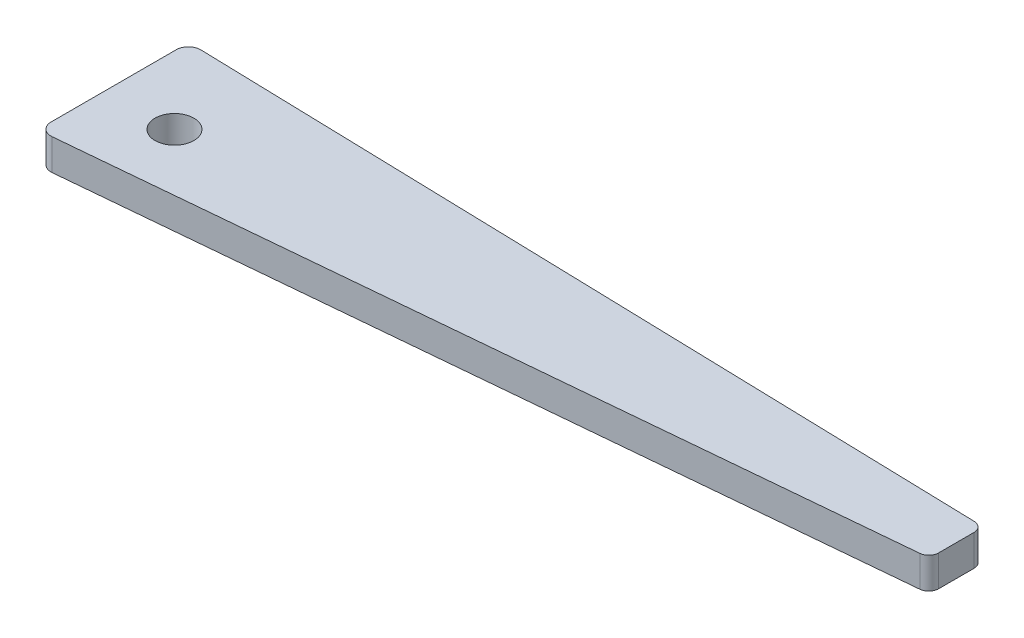
ISO-10303-21;
HEADER;
FILE_DESCRIPTION(('STEP AP214'),'2;1');
FILE_NAME('part.step','',(''),(''),'','','');
FILE_SCHEMA(('AUTOMOTIVE_DESIGN { 1 0 10303 214 1 1 1 1 }'));
ENDSEC;
DATA;
#1=APPLICATION_CONTEXT('core data for automotive mechanical design processes');
#2=APPLICATION_PROTOCOL_DEFINITION('international standard','automotive_design',2000,#1);
#3=PRODUCT_CONTEXT('',#1,'mechanical');
#4=PRODUCT('Part','Part','',(#3));
#5=PRODUCT_RELATED_PRODUCT_CATEGORY('part','',(#4));
#6=PRODUCT_DEFINITION_FORMATION('','',#4);
#7=PRODUCT_DEFINITION_CONTEXT('part definition',#1,'design');
#8=PRODUCT_DEFINITION('design','',#6,#7);
#9=PRODUCT_DEFINITION_SHAPE('','',#8);
#10=(LENGTH_UNIT() NAMED_UNIT(*) SI_UNIT(.MILLI.,.METRE.));
#11=(NAMED_UNIT(*) PLANE_ANGLE_UNIT() SI_UNIT($,.RADIAN.));
#12=(NAMED_UNIT(*) SI_UNIT($,.STERADIAN.) SOLID_ANGLE_UNIT());
#13=UNCERTAINTY_MEASURE_WITH_UNIT(LENGTH_MEASURE(1.E-05),#10,'distance_accuracy_value','');
#14=(GEOMETRIC_REPRESENTATION_CONTEXT(3) GLOBAL_UNCERTAINTY_ASSIGNED_CONTEXT((#13)) GLOBAL_UNIT_ASSIGNED_CONTEXT((#10,
#11,#12)) REPRESENTATION_CONTEXT('',''));
#15=CARTESIAN_POINT('',(0.,0.,0.));
#16=DIRECTION('',(0.,0.,1.));
#17=DIRECTION('',(1.,0.,0.));
#18=AXIS2_PLACEMENT_3D('',#15,#16,#17);
#19=CARTESIAN_POINT('',(41.5,1.6,-4.31765934935754));
#20=DIRECTION('',(0.,-1.,0.));
#21=DIRECTION('',(0.,0.,-1.));
#22=AXIS2_PLACEMENT_3D('',#19,#20,#21);
#23=CYLINDRICAL_SURFACE('',#22,0.5);
#24=CARTESIAN_POINT('',(41.5,0.,-4.31765934935754));
#25=DIRECTION('',(0.,1.,0.));
#26=DIRECTION('',(0.,0.,1.));
#27=AXIS2_PLACEMENT_3D('',#24,#25,#26);
#28=CIRCLE('',#27,0.5);
#29=CARTESIAN_POINT('',(41.5457774137299,0.,-3.81975933088777));
#30=VERTEX_POINT('',#29);
#31=CARTESIAN_POINT('',(42.,0.,-4.31765934935755));
#32=VERTEX_POINT('',#31);
#33=EDGE_CURVE('E133',#30,#32,#28,.T.);
#34=ORIENTED_EDGE('',*,*,#33,.T.);
#35=DIRECTION('',(0.,-1.,0.));
#36=VECTOR('',#35,1.);
#37=CARTESIAN_POINT('',(42.,1.6,-4.31765934935755));
#38=LINE('',#37,#36);
#39=CARTESIAN_POINT('',(42.,1.6,-4.31765934935755));
#40=VERTEX_POINT('',#39);
#41=EDGE_CURVE('E11',#40,#32,#38,.T.);
#42=ORIENTED_EDGE('',*,*,#41,.F.);
#43=CARTESIAN_POINT('',(41.5,1.6,-4.31765934935754));
#44=DIRECTION('',(0.,1.,0.));
#45=DIRECTION('',(0.,0.,1.));
#46=AXIS2_PLACEMENT_3D('',#43,#44,#45);
#47=CIRCLE('',#46,0.5);
#48=CARTESIAN_POINT('',(41.5457774137299,1.6,-3.81975933088777));
#49=VERTEX_POINT('',#48);
#50=EDGE_CURVE('E148',#49,#40,#47,.T.);
#51=ORIENTED_EDGE('',*,*,#50,.F.);
#52=DIRECTION('',(0.,-1.,0.));
#53=VECTOR('',#52,1.);
#54=CARTESIAN_POINT('',(41.5457774137299,1.6,-3.81975933088777));
#55=LINE('',#54,#53);
#56=EDGE_CURVE('E129',#49,#30,#55,.T.);
#57=ORIENTED_EDGE('',*,*,#56,.T.);
#58=EDGE_LOOP('',(#34,#42,#51,#57));
#59=FACE_BOUND('',#58,.T.);
#60=ADVANCED_FACE('F37',(#59),#23,.T.);
#61=CARTESIAN_POINT('',(42.,1.6,-4.31765934935755));
#62=DIRECTION('',(-1.,0.,0.));
#63=DIRECTION('',(0.,0.,1.));
#64=AXIS2_PLACEMENT_3D('',#61,#62,#63);
#65=PLANE('',#64);
#66=DIRECTION('',(0.,0.,-1.));
#67=VECTOR('',#66,1.);
#68=CARTESIAN_POINT('',(42.,0.,-4.31765934935755));
#69=LINE('',#68,#67);
#70=CARTESIAN_POINT('',(42.,0.,-6.13999611769491));
#71=VERTEX_POINT('',#70);
#72=EDGE_CURVE('E136',#32,#71,#69,.T.);
#73=ORIENTED_EDGE('',*,*,#72,.T.);
#74=DIRECTION('',(0.,-1.,0.));
#75=VECTOR('',#74,1.);
#76=CARTESIAN_POINT('',(42.,1.6,-6.13999611769491));
#77=LINE('',#76,#75);
#78=CARTESIAN_POINT('',(42.,1.6,-6.13999611769491));
#79=VERTEX_POINT('',#78);
#80=EDGE_CURVE('E45',#79,#71,#77,.T.);
#81=ORIENTED_EDGE('',*,*,#80,.F.);
#82=DIRECTION('',(0.,0.,-1.));
#83=VECTOR('',#82,1.);
#84=CARTESIAN_POINT('',(42.,1.6,-4.31765934935755));
#85=LINE('',#84,#83);
#86=EDGE_CURVE('E96',#40,#79,#85,.T.);
#87=ORIENTED_EDGE('',*,*,#86,.F.);
#88=ORIENTED_EDGE('',*,*,#41,.T.);
#89=EDGE_LOOP('',(#73,#81,#87,#88));
#90=FACE_BOUND('',#89,.T.);
#91=ADVANCED_FACE('F204',(#90),#65,.F.);
#92=CARTESIAN_POINT('',(41.5,1.6,-6.13999611769492));
#93=DIRECTION('',(0.,-1.,0.));
#94=DIRECTION('',(0.,0.,-1.));
#95=AXIS2_PLACEMENT_3D('',#92,#93,#94);
#96=CYLINDRICAL_SURFACE('',#95,0.500000000000001);
#97=CARTESIAN_POINT('',(41.5,0.,-6.13999611769492));
#98=DIRECTION('',(0.,1.,0.));
#99=DIRECTION('',(0.,0.,1.));
#100=AXIS2_PLACEMENT_3D('',#97,#98,#99);
#101=CIRCLE('',#100,0.500000000000001);
#102=CARTESIAN_POINT('',(41.5136158340435,0.,-6.63981069237567));
#103=VERTEX_POINT('',#102);
#104=EDGE_CURVE('E139',#71,#103,#101,.T.);
#105=ORIENTED_EDGE('',*,*,#104,.T.);
#106=DIRECTION('',(0.,-1.,0.));
#107=VECTOR('',#106,1.);
#108=CARTESIAN_POINT('',(41.5136158340435,1.6,-6.63981069237567));
#109=LINE('',#108,#107);
#110=CARTESIAN_POINT('',(41.5136158340435,1.6,-6.63981069237567));
#111=VERTEX_POINT('',#110);
#112=EDGE_CURVE('E155',#111,#103,#109,.T.);
#113=ORIENTED_EDGE('',*,*,#112,.F.);
#114=CARTESIAN_POINT('',(41.5,1.6,-6.13999611769492));
#115=DIRECTION('',(0.,1.,0.));
#116=DIRECTION('',(0.,0.,1.));
#117=AXIS2_PLACEMENT_3D('',#114,#115,#116);
#118=CIRCLE('',#117,0.500000000000001);
#119=EDGE_CURVE('E163',#79,#111,#118,.T.);
#120=ORIENTED_EDGE('',*,*,#119,.F.);
#121=ORIENTED_EDGE('',*,*,#80,.T.);
#122=EDGE_LOOP('',(#105,#113,#120,#121));
#123=FACE_BOUND('',#122,.T.);
#124=ADVANCED_FACE('F161',(#123),#96,.T.);
#125=CARTESIAN_POINT('',(41.5136158340435,1.6,-6.63981069237567));
#126=DIRECTION('',(-0.0272316680870328,0.,0.999629149361501));
#127=DIRECTION('',(0.999629149361501,0.,0.0272316680870328));
#128=AXIS2_PLACEMENT_3D('',#125,#126,#127);
#129=PLANE('',#128);
#130=DIRECTION('',(-0.999629149361501,0.,-0.0272316680870328));
#131=VECTOR('',#130,1.);
#132=CARTESIAN_POINT('',(41.5136158340435,0.,-6.63981069237567));
#133=LINE('',#132,#131);
#134=CARTESIAN_POINT('',(0.647236121998095,0.,-7.75308323844728));
#135=VERTEX_POINT('',#134);
#136=EDGE_CURVE('E141',#103,#135,#133,.T.);
#137=ORIENTED_EDGE('',*,*,#136,.T.);
#138=DIRECTION('',(0.,-1.,0.));
#139=VECTOR('',#138,1.);
#140=CARTESIAN_POINT('',(0.647236121998095,1.6,-7.75308323844728));
#141=LINE('',#140,#139);
#142=CARTESIAN_POINT('',(0.647236121998095,1.6,-7.75308323844728));
#143=VERTEX_POINT('',#142);
#144=EDGE_CURVE('E152',#143,#135,#141,.T.);
#145=ORIENTED_EDGE('',*,*,#144,.F.);
#146=DIRECTION('',(-0.999629149361501,0.,-0.0272316680870328));
#147=VECTOR('',#146,1.);
#148=CARTESIAN_POINT('',(41.5136158340435,1.6,-6.63981069237567));
#149=LINE('',#148,#147);
#150=EDGE_CURVE('E175',#111,#143,#149,.T.);
#151=ORIENTED_EDGE('',*,*,#150,.F.);
#152=ORIENTED_EDGE('',*,*,#112,.T.);
#153=EDGE_LOOP('',(#137,#145,#151,#152));
#154=FACE_BOUND('',#153,.T.);
#155=ADVANCED_FACE('F171',(#154),#129,.F.);
#156=CARTESIAN_POINT('',(0.630078045786312,1.6,-7.12323885750655));
#157=DIRECTION('',(0.,-1.,0.));
#158=DIRECTION('',(0.,0.,-1.));
#159=AXIS2_PLACEMENT_3D('',#156,#157,#158);
#160=CYLINDRICAL_SURFACE('',#159,0.630078045786312);
#161=CARTESIAN_POINT('',(0.630078045786312,0.,-7.12323885750655));
#162=DIRECTION('',(0.,1.,0.));
#163=DIRECTION('',(0.,0.,1.));
#164=AXIS2_PLACEMENT_3D('',#161,#162,#163);
#165=CIRCLE('',#164,0.630078045786312);
#166=CARTESIAN_POINT('',(0.,0.,-7.12323885750654));
#167=VERTEX_POINT('',#166);
#168=EDGE_CURVE('E143',#135,#167,#165,.T.);
#169=ORIENTED_EDGE('',*,*,#168,.T.);
#170=DIRECTION('',(0.,-1.,0.));
#171=VECTOR('',#170,1.);
#172=CARTESIAN_POINT('',(0.,1.6,-7.12323885750654));
#173=LINE('',#172,#171);
#174=CARTESIAN_POINT('',(0.,1.6,-7.12323885750654));
#175=VERTEX_POINT('',#174);
#176=EDGE_CURVE('E124',#175,#167,#173,.T.);
#177=ORIENTED_EDGE('',*,*,#176,.F.);
#178=CARTESIAN_POINT('',(0.630078045786312,1.6,-7.12323885750655));
#179=DIRECTION('',(0.,1.,0.));
#180=DIRECTION('',(0.,0.,1.));
#181=AXIS2_PLACEMENT_3D('',#178,#179,#180);
#182=CIRCLE('',#181,0.630078045786312);
#183=EDGE_CURVE('E115',#143,#175,#182,.T.);
#184=ORIENTED_EDGE('',*,*,#183,.F.);
#185=ORIENTED_EDGE('',*,*,#144,.T.);
#186=EDGE_LOOP('',(#169,#177,#184,#185));
#187=FACE_BOUND('',#186,.T.);
#188=ADVANCED_FACE('F174',(#187),#160,.T.);
#189=CARTESIAN_POINT('',(0.,1.6,-7.12323885750654));
#190=DIRECTION('',(1.,0.,0.));
#191=DIRECTION('',(0.,0.,-1.));
#192=AXIS2_PLACEMENT_3D('',#189,#190,#191);
#193=PLANE('',#192);
#194=DIRECTION('',(0.,0.,1.));
#195=VECTOR('',#194,1.);
#196=CARTESIAN_POINT('',(0.,0.,-7.12323885750654));
#197=LINE('',#196,#195);
#198=CARTESIAN_POINT('',(0.,0.,-0.690665502150667));
#199=VERTEX_POINT('',#198);
#200=EDGE_CURVE('E123',#167,#199,#197,.T.);
#201=ORIENTED_EDGE('',*,*,#200,.T.);
#202=DIRECTION('',(0.,-1.,0.));
#203=VECTOR('',#202,1.);
#204=CARTESIAN_POINT('',(0.,1.6,-0.690665502150667));
#205=LINE('',#204,#203);
#206=CARTESIAN_POINT('',(0.,1.6,-0.690665502150667));
#207=VERTEX_POINT('',#206);
#208=EDGE_CURVE('E120',#207,#199,#205,.T.);
#209=ORIENTED_EDGE('',*,*,#208,.F.);
#210=DIRECTION('',(0.,0.,1.));
#211=VECTOR('',#210,1.);
#212=CARTESIAN_POINT('',(0.,1.6,-7.12323885750654));
#213=LINE('',#212,#211);
#214=EDGE_CURVE('E109',#175,#207,#213,.T.);
#215=ORIENTED_EDGE('',*,*,#214,.F.);
#216=ORIENTED_EDGE('',*,*,#176,.T.);
#217=EDGE_LOOP('',(#201,#209,#215,#216));
#218=FACE_BOUND('',#217,.T.);
#219=ADVANCED_FACE('F121',(#218),#193,.F.);
#220=CARTESIAN_POINT('',(0.630078045786312,1.6,-0.690665502150662));
#221=DIRECTION('',(0.,-1.,0.));
#222=DIRECTION('',(0.,0.,-1.));
#223=AXIS2_PLACEMENT_3D('',#220,#221,#222);
#224=CYLINDRICAL_SURFACE('',#223,0.630078045786312);
#225=CARTESIAN_POINT('',(0.630078045786312,0.,-0.690665502150662));
#226=DIRECTION('',(0.,1.,0.));
#227=DIRECTION('',(0.,0.,-1.));
#228=AXIS2_PLACEMENT_3D('',#225,#226,#227);
#229=CIRCLE('',#228,0.630078045786312);
#230=CARTESIAN_POINT('',(0.687764732554505,0.,-0.0632337608818557));
#231=VERTEX_POINT('',#230);
#232=EDGE_CURVE('E82',#199,#231,#229,.T.);
#233=ORIENTED_EDGE('',*,*,#232,.T.);
#234=DIRECTION('',(0.,-1.,0.));
#235=VECTOR('',#234,1.);
#236=CARTESIAN_POINT('',(0.687764732554505,1.6,-0.0632337608818557));
#237=LINE('',#236,#235);
#238=CARTESIAN_POINT('',(0.687764732554505,1.6,-0.0632337608818557));
#239=VERTEX_POINT('',#238);
#240=EDGE_CURVE('E125',#239,#231,#237,.T.);
#241=ORIENTED_EDGE('',*,*,#240,.F.);
#242=CARTESIAN_POINT('',(0.630078045786312,1.6,-0.690665502150662));
#243=DIRECTION('',(0.,1.,0.));
#244=DIRECTION('',(0.,0.,-1.));
#245=AXIS2_PLACEMENT_3D('',#242,#243,#244);
#246=CIRCLE('',#245,0.630078045786312);
#247=EDGE_CURVE('E113',#207,#239,#246,.T.);
#248=ORIENTED_EDGE('',*,*,#247,.F.);
#249=ORIENTED_EDGE('',*,*,#208,.T.);
#250=EDGE_LOOP('',(#233,#241,#248,#249));
#251=FACE_BOUND('',#250,.T.);
#252=ADVANCED_FACE('F127',(#251),#224,.T.);
#253=CARTESIAN_POINT('',(0.687764732554505,1.6,-0.0632337608818557));
#254=DIRECTION('',(-0.0915548274598222,0.,-0.995800036939546));
#255=DIRECTION('',(-0.995800036939547,0.,0.0915548274598222));
#256=AXIS2_PLACEMENT_3D('',#253,#254,#255);
#257=PLANE('',#256);
#258=DIRECTION('',(0.995800036939547,0.,-0.0915548274598222));
#259=VECTOR('',#258,1.);
#260=CARTESIAN_POINT('',(0.687764732554505,0.,-0.0632337608818557));
#261=LINE('',#260,#259);
#262=EDGE_CURVE('E88',#231,#30,#261,.T.);
#263=ORIENTED_EDGE('',*,*,#262,.T.);
#264=ORIENTED_EDGE('',*,*,#56,.F.);
#265=DIRECTION('',(0.995800036939547,0.,-0.0915548274598222));
#266=VECTOR('',#265,1.);
#267=CARTESIAN_POINT('',(0.687764732554505,1.6,-0.0632337608818557));
#268=LINE('',#267,#266);
#269=EDGE_CURVE('E53',#239,#49,#268,.T.);
#270=ORIENTED_EDGE('',*,*,#269,.F.);
#271=ORIENTED_EDGE('',*,*,#240,.T.);
#272=EDGE_LOOP('',(#263,#264,#270,#271));
#273=FACE_BOUND('',#272,.T.);
#274=ADVANCED_FACE('F195',(#273),#257,.F.);
#275=CARTESIAN_POINT('',(41.5,1.6,-4.31765934935754));
#276=DIRECTION('',(0.,1.,0.));
#277=DIRECTION('',(0.,0.,1.));
#278=AXIS2_PLACEMENT_3D('',#275,#276,#277);
#279=PLANE('',#278);
#280=CARTESIAN_POINT('',(3.5,1.6,-3.53528998344785));
#281=DIRECTION('',(0.,1.,0.));
#282=DIRECTION('',(0.,0.,1.));
#283=AXIS2_PLACEMENT_3D('',#280,#281,#282);
#284=CIRCLE('',#283,0.999999999999999);
#285=CARTESIAN_POINT('',(3.5,1.6,-2.53528998344785));
#286=VERTEX_POINT('',#285);
#287=EDGE_CURVE('E181',#286,#286,#284,.T.);
#288=ORIENTED_EDGE('',*,*,#287,.F.);
#289=EDGE_LOOP('',(#288));
#290=FACE_BOUND('',#289,.T.);
#291=ORIENTED_EDGE('',*,*,#50,.T.);
#292=ORIENTED_EDGE('',*,*,#86,.T.);
#293=ORIENTED_EDGE('',*,*,#119,.T.);
#294=ORIENTED_EDGE('',*,*,#150,.T.);
#295=ORIENTED_EDGE('',*,*,#183,.T.);
#296=ORIENTED_EDGE('',*,*,#214,.T.);
#297=ORIENTED_EDGE('',*,*,#247,.T.);
#298=ORIENTED_EDGE('',*,*,#269,.T.);
#299=EDGE_LOOP('',(#291,#292,#293,#294,#295,#296,#297,#298));
#300=FACE_BOUND('',#299,.T.);
#301=ADVANCED_FACE('F111',(#290,#300),#279,.T.);
#302=CARTESIAN_POINT('',(41.5,0.,-4.31765934935754));
#303=DIRECTION('',(0.,1.,0.));
#304=DIRECTION('',(0.,0.,1.));
#305=AXIS2_PLACEMENT_3D('',#302,#303,#304);
#306=PLANE('',#305);
#307=CARTESIAN_POINT('',(3.5,0.,-3.53528998344785));
#308=DIRECTION('',(0.,1.,0.));
#309=DIRECTION('',(0.,0.,1.));
#310=AXIS2_PLACEMENT_3D('',#307,#308,#309);
#311=CIRCLE('',#310,0.999999999999999);
#312=CARTESIAN_POINT('',(3.5,0.,-2.53528998344785));
#313=VERTEX_POINT('',#312);
#314=EDGE_CURVE('E137',#313,#313,#311,.T.);
#315=ORIENTED_EDGE('',*,*,#314,.T.);
#316=EDGE_LOOP('',(#315));
#317=FACE_BOUND('',#316,.T.);
#318=ORIENTED_EDGE('',*,*,#33,.F.);
#319=ORIENTED_EDGE('',*,*,#262,.F.);
#320=ORIENTED_EDGE('',*,*,#232,.F.);
#321=ORIENTED_EDGE('',*,*,#200,.F.);
#322=ORIENTED_EDGE('',*,*,#168,.F.);
#323=ORIENTED_EDGE('',*,*,#136,.F.);
#324=ORIENTED_EDGE('',*,*,#104,.F.);
#325=ORIENTED_EDGE('',*,*,#72,.F.);
#326=EDGE_LOOP('',(#318,#319,#320,#321,#322,#323,#324,#325));
#327=FACE_BOUND('',#326,.T.);
#328=ADVANCED_FACE('F167',(#317,#327),#306,.F.);
#329=CARTESIAN_POINT('',(3.5,0.,-3.53528998344785));
#330=DIRECTION('',(0.,1.,0.));
#331=DIRECTION('',(0.,0.,1.));
#332=AXIS2_PLACEMENT_3D('',#329,#330,#331);
#333=CYLINDRICAL_SURFACE('',#332,0.999999999999999);
#334=ORIENTED_EDGE('',*,*,#314,.F.);
#335=EDGE_LOOP('',(#334));
#336=FACE_BOUND('',#335,.T.);
#337=ORIENTED_EDGE('',*,*,#287,.T.);
#338=EDGE_LOOP('',(#337));
#339=FACE_BOUND('',#338,.T.);
#340=ADVANCED_FACE('F188',(#336,#339),#333,.F.);
#341=CLOSED_SHELL('',(#60,#91,#124,#155,#188,#219,#252,#274,#301,#328,#340));
#342=MANIFOLD_SOLID_BREP('B2',#341);
#343=ADVANCED_BREP_SHAPE_REPRESENTATION('',(#18,#342),#14);
#344=SHAPE_DEFINITION_REPRESENTATION(#9,#343);
ENDSEC;
END-ISO-10303-21;
